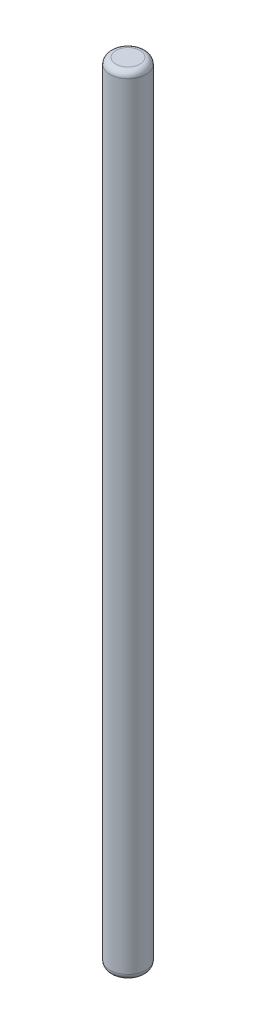
ISO-10303-21;
HEADER;
FILE_DESCRIPTION(('STEP AP214'),'2;1');
FILE_NAME('part.step','',(''),(''),'','','');
FILE_SCHEMA(('AUTOMOTIVE_DESIGN { 1 0 10303 214 1 1 1 1 }'));
ENDSEC;
DATA;
#1=APPLICATION_CONTEXT('core data for automotive mechanical design processes');
#2=APPLICATION_PROTOCOL_DEFINITION('international standard','automotive_design',2000,#1);
#3=PRODUCT_CONTEXT('',#1,'mechanical');
#4=PRODUCT('Part','Part','',(#3));
#5=PRODUCT_RELATED_PRODUCT_CATEGORY('part','',(#4));
#6=PRODUCT_DEFINITION_FORMATION('','',#4);
#7=PRODUCT_DEFINITION_CONTEXT('part definition',#1,'design');
#8=PRODUCT_DEFINITION('design','',#6,#7);
#9=PRODUCT_DEFINITION_SHAPE('','',#8);
#10=(LENGTH_UNIT() NAMED_UNIT(*) SI_UNIT(.MILLI.,.METRE.));
#11=(NAMED_UNIT(*) PLANE_ANGLE_UNIT() SI_UNIT($,.RADIAN.));
#12=(NAMED_UNIT(*) SI_UNIT($,.STERADIAN.) SOLID_ANGLE_UNIT());
#13=UNCERTAINTY_MEASURE_WITH_UNIT(LENGTH_MEASURE(1.E-05),#10,'distance_accuracy_value','');
#14=(GEOMETRIC_REPRESENTATION_CONTEXT(3) GLOBAL_UNCERTAINTY_ASSIGNED_CONTEXT((#13)) GLOBAL_UNIT_ASSIGNED_CONTEXT((#10,
#11,#12)) REPRESENTATION_CONTEXT('',''));
#15=CARTESIAN_POINT('',(0.,0.,0.));
#16=DIRECTION('',(0.,0.,1.));
#17=DIRECTION('',(1.,0.,0.));
#18=AXIS2_PLACEMENT_3D('',#15,#16,#17);
#19=CARTESIAN_POINT('',(0.,132.,0.));
#20=DIRECTION('',(0.,-1.,0.));
#21=DIRECTION('',(0.,0.,-1.));
#22=AXIS2_PLACEMENT_3D('',#19,#20,#21);
#23=CYLINDRICAL_SURFACE('',#22,3.);
#24=CARTESIAN_POINT('',(0.,1.,0.));
#25=DIRECTION('',(0.,1.,0.));
#26=DIRECTION('',(0.,0.,1.));
#27=AXIS2_PLACEMENT_3D('',#24,#25,#26);
#28=CIRCLE('',#27,3.);
#29=CARTESIAN_POINT('',(0.,1.,3.));
#30=VERTEX_POINT('',#29);
#31=EDGE_CURVE('E54',#30,#30,#28,.T.);
#32=ORIENTED_EDGE('',*,*,#31,.T.);
#33=EDGE_LOOP('',(#32));
#34=FACE_BOUND('',#33,.T.);
#35=CARTESIAN_POINT('',(0.,131.,0.));
#36=DIRECTION('',(0.,1.,0.));
#37=DIRECTION('',(0.,0.,1.));
#38=AXIS2_PLACEMENT_3D('',#35,#36,#37);
#39=CIRCLE('',#38,3.);
#40=CARTESIAN_POINT('',(0.,131.,3.));
#41=VERTEX_POINT('',#40);
#42=EDGE_CURVE('E59',#41,#41,#39,.F.);
#43=ORIENTED_EDGE('',*,*,#42,.T.);
#44=EDGE_LOOP('',(#43));
#45=FACE_BOUND('',#44,.T.);
#46=ADVANCED_FACE('F41',(#34,#45),#23,.T.);
#47=CARTESIAN_POINT('',(0.,132.,0.));
#48=DIRECTION('',(0.,1.,0.));
#49=DIRECTION('',(0.,0.,1.));
#50=AXIS2_PLACEMENT_3D('',#47,#48,#49);
#51=PLANE('',#50);
#52=CARTESIAN_POINT('',(0.,132.,0.));
#53=DIRECTION('',(0.,1.,0.));
#54=DIRECTION('',(0.,0.,1.));
#55=AXIS2_PLACEMENT_3D('',#52,#53,#54);
#56=CIRCLE('',#55,2.);
#57=CARTESIAN_POINT('',(0.,132.,2.));
#58=VERTEX_POINT('',#57);
#59=EDGE_CURVE('E10',#58,#58,#56,.T.);
#60=ORIENTED_EDGE('',*,*,#59,.T.);
#61=EDGE_LOOP('',(#60));
#62=FACE_BOUND('',#61,.T.);
#63=ADVANCED_FACE('F76',(#62),#51,.T.);
#64=CARTESIAN_POINT('',(0.,0.,0.));
#65=DIRECTION('',(0.,1.,0.));
#66=DIRECTION('',(0.,0.,1.));
#67=AXIS2_PLACEMENT_3D('',#64,#65,#66);
#68=PLANE('',#67);
#69=CARTESIAN_POINT('',(0.,0.,0.));
#70=DIRECTION('',(0.,1.,0.));
#71=DIRECTION('',(0.,0.,1.));
#72=AXIS2_PLACEMENT_3D('',#69,#70,#71);
#73=CIRCLE('',#72,2.);
#74=CARTESIAN_POINT('',(0.,0.,2.));
#75=VERTEX_POINT('',#74);
#76=EDGE_CURVE('E49',#75,#75,#73,.F.);
#77=ORIENTED_EDGE('',*,*,#76,.T.);
#78=EDGE_LOOP('',(#77));
#79=FACE_BOUND('',#78,.T.);
#80=ADVANCED_FACE('F73',(#79),#68,.F.);
#81=CARTESIAN_POINT('',(0.,1.,0.));
#82=DIRECTION('',(0.,1.,0.));
#83=DIRECTION('',(0.,0.,1.));
#84=AXIS2_PLACEMENT_3D('',#81,#82,#83);
#85=TOROIDAL_SURFACE('',#84,2.,1.);
#86=ORIENTED_EDGE('',*,*,#76,.F.);
#87=EDGE_LOOP('',(#86));
#88=FACE_BOUND('',#87,.T.);
#89=ORIENTED_EDGE('',*,*,#31,.F.);
#90=EDGE_LOOP('',(#89));
#91=FACE_BOUND('',#90,.T.);
#92=ADVANCED_FACE('F69',(#88,#91),#85,.T.);
#93=CARTESIAN_POINT('',(0.,131.,0.));
#94=DIRECTION('',(0.,1.,0.));
#95=DIRECTION('',(0.,0.,1.));
#96=AXIS2_PLACEMENT_3D('',#93,#94,#95);
#97=TOROIDAL_SURFACE('',#96,2.,1.);
#98=ORIENTED_EDGE('',*,*,#42,.F.);
#99=EDGE_LOOP('',(#98));
#100=FACE_BOUND('',#99,.T.);
#101=ORIENTED_EDGE('',*,*,#59,.F.);
#102=EDGE_LOOP('',(#101));
#103=FACE_BOUND('',#102,.T.);
#104=ADVANCED_FACE('F43',(#100,#103),#97,.T.);
#105=CLOSED_SHELL('',(#46,#63,#80,#92,#104));
#106=MANIFOLD_SOLID_BREP('B2',#105);
#107=ADVANCED_BREP_SHAPE_REPRESENTATION('',(#18,#106),#14);
#108=SHAPE_DEFINITION_REPRESENTATION(#9,#107);
ENDSEC;
END-ISO-10303-21;
